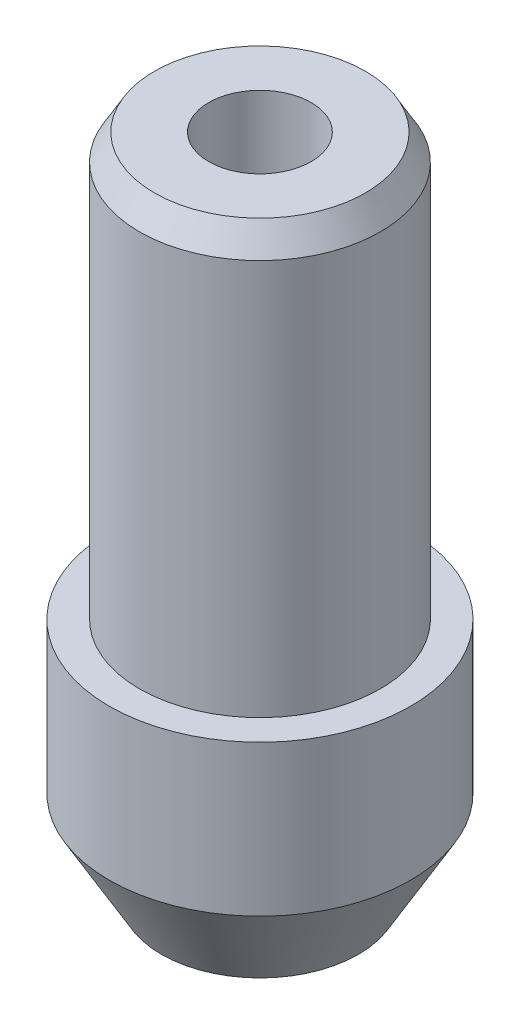
ISO-10303-21;
HEADER;
FILE_DESCRIPTION(('STEP AP214'),'2;1');
FILE_NAME('part.step','',(''),(''),'','','');
FILE_SCHEMA(('AUTOMOTIVE_DESIGN { 1 0 10303 214 1 1 1 1 }'));
ENDSEC;
DATA;
#1=APPLICATION_CONTEXT('core data for automotive mechanical design processes');
#2=APPLICATION_PROTOCOL_DEFINITION('international standard','automotive_design',2000,#1);
#3=PRODUCT_CONTEXT('',#1,'mechanical');
#4=PRODUCT('Part','Part','',(#3));
#5=PRODUCT_RELATED_PRODUCT_CATEGORY('part','',(#4));
#6=PRODUCT_DEFINITION_FORMATION('','',#4);
#7=PRODUCT_DEFINITION_CONTEXT('part definition',#1,'design');
#8=PRODUCT_DEFINITION('design','',#6,#7);
#9=PRODUCT_DEFINITION_SHAPE('','',#8);
#10=(LENGTH_UNIT() NAMED_UNIT(*) SI_UNIT(.MILLI.,.METRE.));
#11=(NAMED_UNIT(*) PLANE_ANGLE_UNIT() SI_UNIT($,.RADIAN.));
#12=(NAMED_UNIT(*) SI_UNIT($,.STERADIAN.) SOLID_ANGLE_UNIT());
#13=UNCERTAINTY_MEASURE_WITH_UNIT(LENGTH_MEASURE(1.E-05),#10,'distance_accuracy_value','');
#14=(GEOMETRIC_REPRESENTATION_CONTEXT(3) GLOBAL_UNCERTAINTY_ASSIGNED_CONTEXT((#13)) GLOBAL_UNIT_ASSIGNED_CONTEXT((#10,
#11,#12)) REPRESENTATION_CONTEXT('',''));
#15=CARTESIAN_POINT('',(0.,0.,0.));
#16=DIRECTION('',(0.,0.,1.));
#17=DIRECTION('',(1.,0.,0.));
#18=AXIS2_PLACEMENT_3D('',#15,#16,#17);
#19=CARTESIAN_POINT('',(0.,26.0202990596303,0.));
#20=DIRECTION('',(0.,1.,0.));
#21=DIRECTION('',(0.,0.,1.));
#22=AXIS2_PLACEMENT_3D('',#19,#20,#21);
#23=CONICAL_SURFACE('',#22,3.4,1.0471975511966);
#24=CARTESIAN_POINT('',(0.,24.0573081443856,0.));
#25=VERTEX_POINT('',#24);
#26=VERTEX_LOOP('',#25);
#27=FACE_BOUND('',#26,.T.);
#28=CARTESIAN_POINT('',(0.,26.0202990596303,0.));
#29=DIRECTION('',(0.,1.,0.));
#30=DIRECTION('',(0.,0.,1.));
#31=AXIS2_PLACEMENT_3D('',#28,#29,#30);
#32=CIRCLE('',#31,3.4);
#33=CARTESIAN_POINT('',(0.,26.0202990596303,3.4));
#34=VERTEX_POINT('',#33);
#35=EDGE_CURVE('E54',#34,#34,#32,.T.);
#36=ORIENTED_EDGE('',*,*,#35,.T.);
#37=EDGE_LOOP('',(#36));
#38=FACE_BOUND('',#37,.T.);
#39=ADVANCED_FACE('F40',(#27,#38),#23,.F.);
#40=CARTESIAN_POINT('',(0.,-2.97970094036971,0.));
#41=DIRECTION('',(0.,1.,0.));
#42=DIRECTION('',(0.,0.,1.));
#43=AXIS2_PLACEMENT_3D('',#40,#41,#42);
#44=PLANE('',#43);
#45=CARTESIAN_POINT('',(0.,-2.97970094036971,0.));
#46=DIRECTION('',(0.,1.,0.));
#47=DIRECTION('',(0.,0.,1.));
#48=AXIS2_PLACEMENT_3D('',#45,#46,#47);
#49=CIRCLE('',#48,6.53589838486224);
#50=CARTESIAN_POINT('',(0.,-2.97970094036971,6.53589838486224));
#51=VERTEX_POINT('',#50);
#52=EDGE_CURVE('E11',#51,#51,#49,.T.);
#53=ORIENTED_EDGE('',*,*,#52,.F.);
#54=EDGE_LOOP('',(#53));
#55=FACE_BOUND('',#54,.T.);
#56=ADVANCED_FACE('F51',(#55),#44,.F.);
#57=CARTESIAN_POINT('',(0.,-2.97970094036971,0.));
#58=DIRECTION('',(0.,1.,0.));
#59=DIRECTION('',(0.,0.,1.));
#60=AXIS2_PLACEMENT_3D('',#57,#58,#59);
#61=CONICAL_SURFACE('',#60,6.53589838486224,0.5235987755983);
#62=CARTESIAN_POINT('',(0.,3.0202990596303,0.));
#63=DIRECTION('',(0.,1.,0.));
#64=DIRECTION('',(0.,0.,1.));
#65=AXIS2_PLACEMENT_3D('',#62,#63,#64);
#66=CIRCLE('',#65,10.);
#67=CARTESIAN_POINT('',(0.,3.0202990596303,10.));
#68=VERTEX_POINT('',#67);
#69=EDGE_CURVE('E46',#68,#68,#66,.T.);
#70=ORIENTED_EDGE('',*,*,#69,.F.);
#71=EDGE_LOOP('',(#70));
#72=FACE_BOUND('',#71,.T.);
#73=ORIENTED_EDGE('',*,*,#52,.T.);
#74=EDGE_LOOP('',(#73));
#75=FACE_BOUND('',#74,.T.);
#76=ADVANCED_FACE('F77',(#72,#75),#61,.T.);
#77=CARTESIAN_POINT('',(0.,50.4046692607004,0.));
#78=DIRECTION('',(0.,1.,0.));
#79=DIRECTION('',(0.,0.,1.));
#80=AXIS2_PLACEMENT_3D('',#77,#78,#79);
#81=CYLINDRICAL_SURFACE('',#80,10.);
#82=CARTESIAN_POINT('',(0.,13.0202990596303,0.));
#83=DIRECTION('',(0.,1.,0.));
#84=DIRECTION('',(0.,0.,1.));
#85=AXIS2_PLACEMENT_3D('',#82,#83,#84);
#86=CIRCLE('',#85,10.);
#87=CARTESIAN_POINT('',(0.,13.0202990596303,10.));
#88=VERTEX_POINT('',#87);
#89=EDGE_CURVE('E70',#88,#88,#86,.T.);
#90=ORIENTED_EDGE('',*,*,#89,.F.);
#91=EDGE_LOOP('',(#90));
#92=FACE_BOUND('',#91,.T.);
#93=ORIENTED_EDGE('',*,*,#69,.T.);
#94=EDGE_LOOP('',(#93));
#95=FACE_BOUND('',#94,.T.);
#96=ADVANCED_FACE('F75',(#92,#95),#81,.T.);
#97=CARTESIAN_POINT('',(8.00000000000001,13.0202990596303,0.));
#98=DIRECTION('',(0.,-1.,0.));
#99=DIRECTION('',(0.,0.,-1.));
#100=AXIS2_PLACEMENT_3D('',#97,#98,#99);
#101=PLANE('',#100);
#102=CARTESIAN_POINT('',(0.,13.0202990596303,0.));
#103=DIRECTION('',(0.,1.,0.));
#104=DIRECTION('',(0.,0.,1.));
#105=AXIS2_PLACEMENT_3D('',#102,#103,#104);
#106=CIRCLE('',#105,8.00000000000001);
#107=CARTESIAN_POINT('',(0.,13.0202990596303,8.00000000000001));
#108=VERTEX_POINT('',#107);
#109=EDGE_CURVE('E67',#108,#108,#106,.T.);
#110=ORIENTED_EDGE('',*,*,#109,.F.);
#111=EDGE_LOOP('',(#110));
#112=FACE_BOUND('',#111,.T.);
#113=ORIENTED_EDGE('',*,*,#89,.T.);
#114=EDGE_LOOP('',(#113));
#115=FACE_BOUND('',#114,.T.);
#116=ADVANCED_FACE('F89',(#112,#115),#101,.F.);
#117=CARTESIAN_POINT('',(0.,50.4046692607004,0.));
#118=DIRECTION('',(0.,1.,0.));
#119=DIRECTION('',(0.,0.,1.));
#120=AXIS2_PLACEMENT_3D('',#117,#118,#119);
#121=CYLINDRICAL_SURFACE('',#120,8.);
#122=CARTESIAN_POINT('',(0.,39.2882482520614,0.));
#123=DIRECTION('',(0.,1.,0.));
#124=DIRECTION('',(0.,0.,1.));
#125=AXIS2_PLACEMENT_3D('',#122,#123,#124);
#126=CIRCLE('',#125,8.);
#127=CARTESIAN_POINT('',(0.,39.2882482520614,8.));
#128=VERTEX_POINT('',#127);
#129=EDGE_CURVE('E64',#128,#128,#126,.T.);
#130=ORIENTED_EDGE('',*,*,#129,.F.);
#131=EDGE_LOOP('',(#130));
#132=FACE_BOUND('',#131,.T.);
#133=ORIENTED_EDGE('',*,*,#109,.T.);
#134=EDGE_LOOP('',(#133));
#135=FACE_BOUND('',#134,.T.);
#136=ADVANCED_FACE('F93',(#132,#135),#121,.T.);
#137=CARTESIAN_POINT('',(0.,39.2882482520614,0.));
#138=DIRECTION('',(0.,-1.,0.));
#139=DIRECTION('',(0.,0.,-1.));
#140=AXIS2_PLACEMENT_3D('',#137,#138,#139);
#141=CONICAL_SURFACE('',#140,8.,0.523598775598296);
#142=CARTESIAN_POINT('',(0.,41.0202990596303,0.));
#143=DIRECTION('',(0.,1.,0.));
#144=DIRECTION('',(0.,0.,1.));
#145=AXIS2_PLACEMENT_3D('',#142,#143,#144);
#146=CIRCLE('',#145,7.);
#147=CARTESIAN_POINT('',(0.,41.0202990596303,7.));
#148=VERTEX_POINT('',#147);
#149=EDGE_CURVE('E59',#148,#148,#146,.T.);
#150=ORIENTED_EDGE('',*,*,#149,.F.);
#151=EDGE_LOOP('',(#150));
#152=FACE_BOUND('',#151,.T.);
#153=ORIENTED_EDGE('',*,*,#129,.T.);
#154=EDGE_LOOP('',(#153));
#155=FACE_BOUND('',#154,.T.);
#156=ADVANCED_FACE('F97',(#152,#155),#141,.T.);
#157=CARTESIAN_POINT('',(3.4,41.0202990596303,0.));
#158=DIRECTION('',(0.,-1.,0.));
#159=DIRECTION('',(0.,0.,-1.));
#160=AXIS2_PLACEMENT_3D('',#157,#158,#159);
#161=PLANE('',#160);
#162=CARTESIAN_POINT('',(0.,41.0202990596303,0.));
#163=DIRECTION('',(0.,1.,0.));
#164=DIRECTION('',(0.,0.,1.));
#165=AXIS2_PLACEMENT_3D('',#162,#163,#164);
#166=CIRCLE('',#165,3.4);
#167=CARTESIAN_POINT('',(0.,41.0202990596303,3.4));
#168=VERTEX_POINT('',#167);
#169=EDGE_CURVE('E56',#168,#168,#166,.T.);
#170=ORIENTED_EDGE('',*,*,#169,.F.);
#171=EDGE_LOOP('',(#170));
#172=FACE_BOUND('',#171,.T.);
#173=ORIENTED_EDGE('',*,*,#149,.T.);
#174=EDGE_LOOP('',(#173));
#175=FACE_BOUND('',#174,.T.);
#176=ADVANCED_FACE('F101',(#172,#175),#161,.F.);
#177=CARTESIAN_POINT('',(0.,50.4046692607004,0.));
#178=DIRECTION('',(0.,1.,0.));
#179=DIRECTION('',(0.,0.,1.));
#180=AXIS2_PLACEMENT_3D('',#177,#178,#179);
#181=CYLINDRICAL_SURFACE('',#180,3.4);
#182=ORIENTED_EDGE('',*,*,#35,.F.);
#183=EDGE_LOOP('',(#182));
#184=FACE_BOUND('',#183,.T.);
#185=ORIENTED_EDGE('',*,*,#169,.T.);
#186=EDGE_LOOP('',(#185));
#187=FACE_BOUND('',#186,.T.);
#188=ADVANCED_FACE('F105',(#184,#187),#181,.F.);
#189=CLOSED_SHELL('',(#39,#56,#76,#96,#116,#136,#156,#176,#188));
#190=MANIFOLD_SOLID_BREP('B2',#189);
#191=ADVANCED_BREP_SHAPE_REPRESENTATION('',(#18,#190),#14);
#192=SHAPE_DEFINITION_REPRESENTATION(#9,#191);
ENDSEC;
END-ISO-10303-21;
